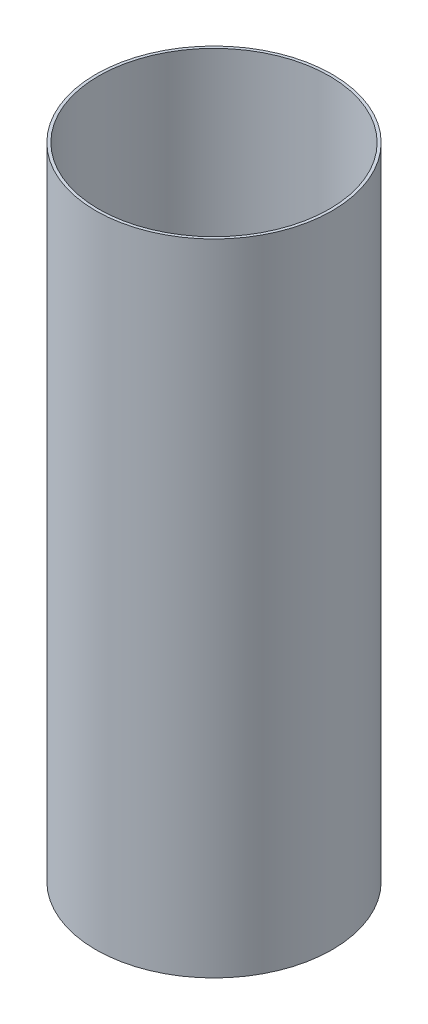
ISO-10303-21;
HEADER;
FILE_DESCRIPTION(('STEP AP214'),'2;1');
FILE_NAME('part.step','',(''),(''),'','','');
FILE_SCHEMA(('AUTOMOTIVE_DESIGN { 1 0 10303 214 1 1 1 1 }'));
ENDSEC;
DATA;
#1=APPLICATION_CONTEXT('core data for automotive mechanical design processes');
#2=APPLICATION_PROTOCOL_DEFINITION('international standard','automotive_design',2000,#1);
#3=PRODUCT_CONTEXT('',#1,'mechanical');
#4=PRODUCT('Part','Part','',(#3));
#5=PRODUCT_RELATED_PRODUCT_CATEGORY('part','',(#4));
#6=PRODUCT_DEFINITION_FORMATION('','',#4);
#7=PRODUCT_DEFINITION_CONTEXT('part definition',#1,'design');
#8=PRODUCT_DEFINITION('design','',#6,#7);
#9=PRODUCT_DEFINITION_SHAPE('','',#8);
#10=(LENGTH_UNIT() NAMED_UNIT(*) SI_UNIT(.MILLI.,.METRE.));
#11=(NAMED_UNIT(*) PLANE_ANGLE_UNIT() SI_UNIT($,.RADIAN.));
#12=(NAMED_UNIT(*) SI_UNIT($,.STERADIAN.) SOLID_ANGLE_UNIT());
#13=UNCERTAINTY_MEASURE_WITH_UNIT(LENGTH_MEASURE(1.E-05),#10,'distance_accuracy_value','');
#14=(GEOMETRIC_REPRESENTATION_CONTEXT(3) GLOBAL_UNCERTAINTY_ASSIGNED_CONTEXT((#13)) GLOBAL_UNIT_ASSIGNED_CONTEXT((#10,
#11,#12)) REPRESENTATION_CONTEXT('',''));
#15=CARTESIAN_POINT('',(0.,0.,0.));
#16=DIRECTION('',(0.,0.,1.));
#17=DIRECTION('',(1.,0.,0.));
#18=AXIS2_PLACEMENT_3D('',#15,#16,#17);
#19=CARTESIAN_POINT('',(0.,180.,0.));
#20=DIRECTION('',(0.,-1.,0.));
#21=DIRECTION('',(0.,0.,-1.));
#22=AXIS2_PLACEMENT_3D('',#19,#20,#21);
#23=CYLINDRICAL_SURFACE('',#22,32.45);
#24=CARTESIAN_POINT('',(0.,180.,0.));
#25=DIRECTION('',(0.,1.,0.));
#26=DIRECTION('',(1.,0.,0.));
#27=AXIS2_PLACEMENT_3D('',#24,#25,#26);
#28=CIRCLE('',#27,32.45);
#29=CARTESIAN_POINT('',(32.45,180.,0.));
#30=VERTEX_POINT('',#29);
#31=EDGE_CURVE('E348',#30,#30,#28,.T.);
#32=ORIENTED_EDGE('',*,*,#31,.T.);
#33=EDGE_LOOP('',(#32));
#34=FACE_BOUND('',#33,.T.);
#35=CARTESIAN_POINT('',(0.,3.,0.));
#36=DIRECTION('',(0.,-1.,0.));
#37=DIRECTION('',(0.,0.,-1.));
#38=AXIS2_PLACEMENT_3D('',#35,#36,#37);
#39=CIRCLE('',#38,32.45);
#40=CARTESIAN_POINT('',(-31.4616846497916,3.,7.94763480521534));
#41=VERTEX_POINT('',#40);
#42=CARTESIAN_POINT('',(-31.8805799123692,3.,6.05236519478465));
#43=VERTEX_POINT('',#42);
#44=EDGE_CURVE('E12',#41,#43,#39,.T.);
#45=ORIENTED_EDGE('',*,*,#44,.T.);
#46=CARTESIAN_POINT('',(0.,-343.739769784556,0.));
#47=DIRECTION('',(0.,0.0174524064372835,-0.999847695156391));
#48=DIRECTION('',(0.,-0.999847695156391,-0.0174524064372835));
#49=AXIS2_PLACEMENT_3D('',#46,#47,#48);
#50=ELLIPSE('',#49,1859.34244177795,32.45);
#51=CARTESIAN_POINT('',(-31.8865286339992,1.20000000000001,6.02094607791386));
#52=VERTEX_POINT('',#51);
#53=EDGE_CURVE('E193',#43,#52,#50,.F.);
#54=ORIENTED_EDGE('',*,*,#53,.T.);
#55=CARTESIAN_POINT('',(0.,1.20000000000001,0.));
#56=DIRECTION('',(0.,1.,0.));
#57=DIRECTION('',(0.,0.,1.));
#58=AXIS2_PLACEMENT_3D('',#55,#56,#57);
#59=CIRCLE('',#58,32.45);
#60=CARTESIAN_POINT('',(-13.5,1.20000000000001,-29.5085157200426));
#61=VERTEX_POINT('',#60);
#62=EDGE_CURVE('E362',#61,#52,#59,.T.);
#63=ORIENTED_EDGE('',*,*,#62,.F.);
#64=CARTESIAN_POINT('',(0.,-0.240000000000018,0.));
#65=DIRECTION('',(0.106064981392206,0.994359200551929,0.));
#66=DIRECTION('',(0.994359200551929,-0.106064981392206,0.));
#67=AXIS2_PLACEMENT_3D('',#64,#65,#66);
#68=ELLIPSE('',#67,32.6340823135023,32.45);
#69=CARTESIAN_POINT('',(-6.00000000000001,0.4,-31.8904766348827));
#70=VERTEX_POINT('',#69);
#71=EDGE_CURVE('E477',#61,#70,#68,.F.);
#72=ORIENTED_EDGE('',*,*,#71,.T.);
#73=DIRECTION('',(0.,-1.,0.));
#74=VECTOR('',#73,1.);
#75=CARTESIAN_POINT('',(-6.00000000000001,180.,-31.8904766348827));
#76=LINE('',#75,#74);
#77=CARTESIAN_POINT('',(-6.00000000000001,1.20000000000001,-31.8904766348827));
#78=VERTEX_POINT('',#77);
#79=EDGE_CURVE('E393',#70,#78,#76,.F.);
#80=ORIENTED_EDGE('',*,*,#79,.T.);
#81=CARTESIAN_POINT('',(31.4537310745234,1.20000000000002,-7.97905392208613));
#82=VERTEX_POINT('',#81);
#83=EDGE_CURVE('E361',#82,#78,#59,.T.);
#84=ORIENTED_EDGE('',*,*,#83,.F.);
#85=CARTESIAN_POINT('',(0.,458.319693046074,0.));
#86=DIRECTION('',(0.,0.0174524064372835,-0.999847695156391));
#87=DIRECTION('',(0.,-0.999847695156391,-0.0174524064372835));
#88=AXIS2_PLACEMENT_3D('',#85,#86,#87);
#89=ELLIPSE('',#88,1859.34244177795,32.45);
#90=CARTESIAN_POINT('',(31.4616846497916,3.,-7.94763480521534));
#91=VERTEX_POINT('',#90);
#92=EDGE_CURVE('E369',#91,#82,#89,.T.);
#93=ORIENTED_EDGE('',*,*,#92,.F.);
#94=CARTESIAN_POINT('',(0.,3.,0.));
#95=DIRECTION('',(0.,-1.,0.));
#96=DIRECTION('',(0.,0.,-1.));
#97=AXIS2_PLACEMENT_3D('',#94,#95,#96);
#98=CIRCLE('',#97,32.45);
#99=CARTESIAN_POINT('',(31.8345047565749,3.,-6.2902151714875));
#100=VERTEX_POINT('',#99);
#101=EDGE_CURVE('E366',#91,#100,#98,.T.);
#102=ORIENTED_EDGE('',*,*,#101,.T.);
#103=CARTESIAN_POINT('',(0.,-357.366185823739,0.));
#104=DIRECTION('',(0.,0.0174524064372835,0.999847695156391));
#105=DIRECTION('',(0.,-0.999847695156391,0.0174524064372835));
#106=AXIS2_PLACEMENT_3D('',#103,#104,#105);
#107=ELLIPSE('',#106,1859.34244177795,32.45);
#108=CARTESIAN_POINT('',(31.8406967880214,1.20000000000002,-6.25879605461671));
#109=VERTEX_POINT('',#108);
#110=EDGE_CURVE('E55',#100,#109,#107,.F.);
#111=ORIENTED_EDGE('',*,*,#110,.T.);
#112=CARTESIAN_POINT('',(13.5,1.20000000000001,29.5085157200426));
#113=VERTEX_POINT('',#112);
#114=EDGE_CURVE('E357',#113,#109,#59,.T.);
#115=ORIENTED_EDGE('',*,*,#114,.F.);
#116=CARTESIAN_POINT('',(0.,-0.240000000000018,0.));
#117=DIRECTION('',(-0.106064981392206,0.994359200551929,0.));
#118=DIRECTION('',(-0.994359200551929,-0.106064981392206,0.));
#119=AXIS2_PLACEMENT_3D('',#116,#117,#118);
#120=ELLIPSE('',#119,32.6340823135023,32.45);
#121=CARTESIAN_POINT('',(6.00000000000001,0.4,31.8904766348827));
#122=VERTEX_POINT('',#121);
#123=EDGE_CURVE('E398',#113,#122,#120,.F.);
#124=ORIENTED_EDGE('',*,*,#123,.T.);
#125=DIRECTION('',(0.,-1.,0.));
#126=VECTOR('',#125,1.);
#127=CARTESIAN_POINT('',(6.00000000000001,180.,31.8904766348827));
#128=LINE('',#127,#126);
#129=CARTESIAN_POINT('',(6.00000000000001,1.20000000000001,31.8904766348827));
#130=VERTEX_POINT('',#129);
#131=EDGE_CURVE('E420',#122,#130,#128,.F.);
#132=ORIENTED_EDGE('',*,*,#131,.T.);
#133=CARTESIAN_POINT('',(-31.4537310745234,1.20000000000001,7.97905392208613));
#134=VERTEX_POINT('',#133);
#135=EDGE_CURVE('E351',#134,#130,#59,.T.);
#136=ORIENTED_EDGE('',*,*,#135,.F.);
#137=CARTESIAN_POINT('',(0.,458.319693046074,0.));
#138=DIRECTION('',(0.,0.0174524064372835,0.999847695156391));
#139=DIRECTION('',(0.,-0.999847695156391,0.0174524064372835));
#140=AXIS2_PLACEMENT_3D('',#137,#138,#139);
#141=ELLIPSE('',#140,1859.34244177795,32.45);
#142=EDGE_CURVE('E65',#41,#134,#141,.T.);
#143=ORIENTED_EDGE('',*,*,#142,.F.);
#144=EDGE_LOOP('',(#45,#54,#63,#72,#80,#84,#93,#102,#111,#115,#124,#132,#136,#143));
#145=FACE_BOUND('',#144,.T.);
#146=ADVANCED_FACE('F47',(#34,#145),#23,.F.);
#147=CARTESIAN_POINT('',(0.,1.2,0.));
#148=DIRECTION('',(0.,1.,0.));
#149=DIRECTION('',(0.,0.,1.));
#150=AXIS2_PLACEMENT_3D('',#147,#148,#149);
#151=PLANE('',#150);
#152=ORIENTED_EDGE('',*,*,#62,.T.);
#153=DIRECTION('',(-1.,0.,0.));
#154=VECTOR('',#153,1.);
#155=CARTESIAN_POINT('',(0.,1.2,6.02094607791386));
#156=LINE('',#155,#154);
#157=CARTESIAN_POINT('',(-12.1063698592397,1.2,6.02094607791386));
#158=VERTEX_POINT('',#157);
#159=EDGE_CURVE('E497',#52,#158,#156,.F.);
#160=ORIENTED_EDGE('',*,*,#159,.T.);
#161=CARTESIAN_POINT('',(0.,1.2,0.));
#162=DIRECTION('',(0.,1.,0.));
#163=DIRECTION('',(0.,0.,1.));
#164=AXIS2_PLACEMENT_3D('',#161,#162,#163);
#165=CIRCLE('',#164,13.5209460779139);
#166=CARTESIAN_POINT('',(-10.9156163980921,1.2,7.97905392208613));
#167=VERTEX_POINT('',#166);
#168=EDGE_CURVE('E208',#158,#167,#165,.T.);
#169=ORIENTED_EDGE('',*,*,#168,.T.);
#170=DIRECTION('',(1.,0.,0.));
#171=VECTOR('',#170,1.);
#172=CARTESIAN_POINT('',(0.,1.2,7.97905392208613));
#173=LINE('',#172,#171);
#174=EDGE_CURVE('E209',#134,#167,#173,.T.);
#175=ORIENTED_EDGE('',*,*,#174,.F.);
#176=ORIENTED_EDGE('',*,*,#135,.T.);
#177=DIRECTION('',(0.,0.,-1.));
#178=VECTOR('',#177,1.);
#179=CARTESIAN_POINT('',(6.00000000000001,1.2,33.251));
#180=LINE('',#179,#178);
#181=CARTESIAN_POINT('',(6.00000000000001,1.2,31.5));
#182=VERTEX_POINT('',#181);
#183=EDGE_CURVE('E387',#130,#182,#180,.T.);
#184=ORIENTED_EDGE('',*,*,#183,.T.);
#185=DIRECTION('',(1.,0.,0.));
#186=VECTOR('',#185,1.);
#187=CARTESIAN_POINT('',(0.,1.2,31.5));
#188=LINE('',#187,#186);
#189=CARTESIAN_POINT('',(-6.00000000000001,1.2,31.5));
#190=VERTEX_POINT('',#189);
#191=EDGE_CURVE('E403',#190,#182,#188,.T.);
#192=ORIENTED_EDGE('',*,*,#191,.F.);
#193=DIRECTION('',(0.,0.,-1.));
#194=VECTOR('',#193,1.);
#195=CARTESIAN_POINT('',(-6.00000000000001,1.2,0.));
#196=LINE('',#195,#194);
#197=CARTESIAN_POINT('',(-6.00000000000001,1.2,12.0933866224478));
#198=VERTEX_POINT('',#197);
#199=EDGE_CURVE('E406',#190,#198,#196,.T.);
#200=ORIENTED_EDGE('',*,*,#199,.T.);
#201=CARTESIAN_POINT('',(0.,1.2,0.));
#202=DIRECTION('',(0.,-1.,0.));
#203=DIRECTION('',(0.,0.,-1.));
#204=AXIS2_PLACEMENT_3D('',#201,#202,#203);
#205=CIRCLE('',#204,13.5);
#206=CARTESIAN_POINT('',(-13.5,1.2,0.));
#207=VERTEX_POINT('',#206);
#208=EDGE_CURVE('E409',#198,#207,#205,.T.);
#209=ORIENTED_EDGE('',*,*,#208,.T.);
#210=DIRECTION('',(0.,0.,1.));
#211=VECTOR('',#210,1.);
#212=CARTESIAN_POINT('',(-13.5,1.2,-33.251));
#213=LINE('',#212,#211);
#214=EDGE_CURVE('E470',#61,#207,#213,.T.);
#215=ORIENTED_EDGE('',*,*,#214,.F.);
#216=EDGE_LOOP('',(#152,#160,#169,#175,#176,#184,#192,#200,#209,#215));
#217=FACE_BOUND('',#216,.T.);
#218=ADVANCED_FACE('F323',(#217),#151,.T.);
#219=ORIENTED_EDGE('',*,*,#114,.T.);
#220=DIRECTION('',(1.,0.,0.));
#221=VECTOR('',#220,1.);
#222=CARTESIAN_POINT('',(0.,1.2,-6.25879605461671));
#223=LINE('',#222,#221);
#224=CARTESIAN_POINT('',(11.985134742195,1.2,-6.25879605461671));
#225=VERTEX_POINT('',#224);
#226=EDGE_CURVE('E379',#109,#225,#223,.F.);
#227=ORIENTED_EDGE('',*,*,#226,.T.);
#228=CARTESIAN_POINT('',(0.,1.2,0.));
#229=DIRECTION('',(0.,1.,0.));
#230=DIRECTION('',(0.,0.,1.));
#231=AXIS2_PLACEMENT_3D('',#228,#229,#230);
#232=CIRCLE('',#231,13.5209460779139);
#233=CARTESIAN_POINT('',(10.9156163980921,1.2,-7.97905392208613));
#234=VERTEX_POINT('',#233);
#235=EDGE_CURVE('E471',#225,#234,#232,.T.);
#236=ORIENTED_EDGE('',*,*,#235,.T.);
#237=DIRECTION('',(-1.,0.,0.));
#238=VECTOR('',#237,1.);
#239=CARTESIAN_POINT('',(0.,1.2,-7.97905392208613));
#240=LINE('',#239,#238);
#241=EDGE_CURVE('E258',#82,#234,#240,.T.);
#242=ORIENTED_EDGE('',*,*,#241,.F.);
#243=ORIENTED_EDGE('',*,*,#83,.T.);
#244=DIRECTION('',(0.,0.,1.));
#245=VECTOR('',#244,1.);
#246=CARTESIAN_POINT('',(-6.00000000000001,1.2,-33.251));
#247=LINE('',#246,#245);
#248=CARTESIAN_POINT('',(-6.00000000000001,1.2,-31.5));
#249=VERTEX_POINT('',#248);
#250=EDGE_CURVE('E467',#78,#249,#247,.T.);
#251=ORIENTED_EDGE('',*,*,#250,.T.);
#252=DIRECTION('',(1.,0.,0.));
#253=VECTOR('',#252,1.);
#254=CARTESIAN_POINT('',(0.,1.2,-31.5));
#255=LINE('',#254,#253);
#256=CARTESIAN_POINT('',(6.00000000000001,1.2,-31.5));
#257=VERTEX_POINT('',#256);
#258=EDGE_CURVE('E412',#249,#257,#255,.T.);
#259=ORIENTED_EDGE('',*,*,#258,.T.);
#260=DIRECTION('',(0.,0.,-1.));
#261=VECTOR('',#260,1.);
#262=CARTESIAN_POINT('',(6.00000000000001,1.2,0.));
#263=LINE('',#262,#261);
#264=CARTESIAN_POINT('',(6.00000000000001,1.2,-12.0933866224478));
#265=VERTEX_POINT('',#264);
#266=EDGE_CURVE('E399',#265,#257,#263,.T.);
#267=ORIENTED_EDGE('',*,*,#266,.F.);
#268=CARTESIAN_POINT('',(0.,1.2,0.));
#269=DIRECTION('',(0.,-1.,0.));
#270=DIRECTION('',(0.,0.,-1.));
#271=AXIS2_PLACEMENT_3D('',#268,#269,#270);
#272=CIRCLE('',#271,13.5);
#273=CARTESIAN_POINT('',(13.5,1.2,0.));
#274=VERTEX_POINT('',#273);
#275=EDGE_CURVE('E384',#265,#274,#272,.T.);
#276=ORIENTED_EDGE('',*,*,#275,.T.);
#277=DIRECTION('',(0.,0.,-1.));
#278=VECTOR('',#277,1.);
#279=CARTESIAN_POINT('',(13.5,1.2,33.251));
#280=LINE('',#279,#278);
#281=EDGE_CURVE('E381',#113,#274,#280,.T.);
#282=ORIENTED_EDGE('',*,*,#281,.F.);
#283=EDGE_LOOP('',(#219,#227,#236,#242,#243,#251,#259,#267,#276,#282));
#284=FACE_BOUND('',#283,.T.);
#285=ADVANCED_FACE('F300',(#284),#151,.T.);
#286=CARTESIAN_POINT('',(-6.00000000000001,1.2,0.));
#287=DIRECTION('',(-1.,0.,0.));
#288=DIRECTION('',(0.,0.,1.));
#289=AXIS2_PLACEMENT_3D('',#286,#287,#288);
#290=PLANE('',#289);
#291=DIRECTION('',(0.,0.,1.));
#292=VECTOR('',#291,1.);
#293=CARTESIAN_POINT('',(-6.00000000000001,0.4,-33.251));
#294=LINE('',#293,#292);
#295=CARTESIAN_POINT('',(-6.00000000000001,0.4,-31.5));
#296=VERTEX_POINT('',#295);
#297=CARTESIAN_POINT('',(-6.00000000000001,0.4,-12.0933866224478));
#298=VERTEX_POINT('',#297);
#299=EDGE_CURVE('E473',#296,#298,#294,.T.);
#300=ORIENTED_EDGE('',*,*,#299,.T.);
#301=DIRECTION('',(0.,-1.,0.));
#302=VECTOR('',#301,1.);
#303=CARTESIAN_POINT('',(-6.00000000000001,1.2,-12.0933866224478));
#304=LINE('',#303,#302);
#305=CARTESIAN_POINT('',(-6.00000000000001,0.,-12.0933866224478));
#306=VERTEX_POINT('',#305);
#307=EDGE_CURVE('E441',#298,#306,#304,.T.);
#308=ORIENTED_EDGE('',*,*,#307,.T.);
#309=DIRECTION('',(0.,0.,-1.));
#310=VECTOR('',#309,1.);
#311=CARTESIAN_POINT('',(-6.00000000000001,0.,0.));
#312=LINE('',#311,#310);
#313=CARTESIAN_POINT('',(-6.00000000000001,0.,-31.5));
#314=VERTEX_POINT('',#313);
#315=EDGE_CURVE('E342',#306,#314,#312,.T.);
#316=ORIENTED_EDGE('',*,*,#315,.T.);
#317=DIRECTION('',(0.,-1.,0.));
#318=VECTOR('',#317,1.);
#319=CARTESIAN_POINT('',(-6.00000000000001,1.2,-31.5));
#320=LINE('',#319,#318);
#321=EDGE_CURVE('E440',#296,#314,#320,.T.);
#322=ORIENTED_EDGE('',*,*,#321,.F.);
#323=EDGE_LOOP('',(#300,#308,#316,#322));
#324=FACE_BOUND('',#323,.T.);
#325=ADVANCED_FACE('F296',(#324),#290,.F.);
#326=CARTESIAN_POINT('',(0.,1.2,0.));
#327=DIRECTION('',(0.,-1.,0.));
#328=DIRECTION('',(0.,0.,-1.));
#329=AXIS2_PLACEMENT_3D('',#326,#327,#328);
#330=CYLINDRICAL_SURFACE('',#329,13.5);
#331=CARTESIAN_POINT('',(0.,-0.240000000000001,0.));
#332=DIRECTION('',(0.106064981392206,0.994359200551929,0.));
#333=DIRECTION('',(0.994359200551929,-0.106064981392206,0.));
#334=AXIS2_PLACEMENT_3D('',#331,#332,#333);
#335=ELLIPSE('',#334,13.5765827806558,13.5);
#336=EDGE_CURVE('E364',#207,#298,#335,.F.);
#337=ORIENTED_EDGE('',*,*,#336,.F.);
#338=ORIENTED_EDGE('',*,*,#208,.F.);
#339=DIRECTION('',(0.,-1.,0.));
#340=VECTOR('',#339,1.);
#341=CARTESIAN_POINT('',(-6.00000000000001,1.2,12.0933866224478));
#342=LINE('',#341,#340);
#343=CARTESIAN_POINT('',(-6.00000000000001,0.,12.0933866224478));
#344=VERTEX_POINT('',#343);
#345=EDGE_CURVE('E444',#198,#344,#342,.T.);
#346=ORIENTED_EDGE('',*,*,#345,.T.);
#347=CARTESIAN_POINT('',(0.,0.,0.));
#348=DIRECTION('',(0.,-1.,0.));
#349=DIRECTION('',(0.,0.,-1.));
#350=AXIS2_PLACEMENT_3D('',#347,#348,#349);
#351=CIRCLE('',#350,13.5);
#352=EDGE_CURVE('E431',#344,#306,#351,.T.);
#353=ORIENTED_EDGE('',*,*,#352,.T.);
#354=ORIENTED_EDGE('',*,*,#307,.F.);
#355=EDGE_LOOP('',(#337,#338,#346,#353,#354));
#356=FACE_BOUND('',#355,.T.);
#357=ADVANCED_FACE('F299',(#356),#330,.F.);
#358=CARTESIAN_POINT('',(6.00000000000001,1.2,0.));
#359=DIRECTION('',(-1.,0.,0.));
#360=DIRECTION('',(0.,0.,1.));
#361=AXIS2_PLACEMENT_3D('',#358,#359,#360);
#362=PLANE('',#361);
#363=DIRECTION('',(0.,-1.,0.));
#364=VECTOR('',#363,1.);
#365=CARTESIAN_POINT('',(6.00000000000001,1.2,31.5));
#366=LINE('',#365,#364);
#367=CARTESIAN_POINT('',(6.00000000000001,0.4,31.5));
#368=VERTEX_POINT('',#367);
#369=CARTESIAN_POINT('',(6.00000000000001,0.,31.5));
#370=VERTEX_POINT('',#369);
#371=EDGE_CURVE('E451',#368,#370,#366,.T.);
#372=ORIENTED_EDGE('',*,*,#371,.F.);
#373=DIRECTION('',(0.,0.,-1.));
#374=VECTOR('',#373,1.);
#375=CARTESIAN_POINT('',(6.00000000000001,0.4,33.251));
#376=LINE('',#375,#374);
#377=CARTESIAN_POINT('',(6.00000000000001,0.4,12.0933866224478));
#378=VERTEX_POINT('',#377);
#379=EDGE_CURVE('E386',#368,#378,#376,.T.);
#380=ORIENTED_EDGE('',*,*,#379,.T.);
#381=DIRECTION('',(0.,-1.,0.));
#382=VECTOR('',#381,1.);
#383=CARTESIAN_POINT('',(6.00000000000001,1.2,12.0933866224478));
#384=LINE('',#383,#382);
#385=CARTESIAN_POINT('',(6.00000000000001,0.,12.0933866224478));
#386=VERTEX_POINT('',#385);
#387=EDGE_CURVE('E452',#378,#386,#384,.T.);
#388=ORIENTED_EDGE('',*,*,#387,.T.);
#389=DIRECTION('',(0.,0.,-1.));
#390=VECTOR('',#389,1.);
#391=CARTESIAN_POINT('',(6.00000000000001,0.,0.));
#392=LINE('',#391,#390);
#393=EDGE_CURVE('E422',#370,#386,#392,.T.);
#394=ORIENTED_EDGE('',*,*,#393,.F.);
#395=EDGE_LOOP('',(#372,#380,#388,#394));
#396=FACE_BOUND('',#395,.T.);
#397=ADVANCED_FACE('F304',(#396),#362,.T.);
#398=CARTESIAN_POINT('',(0.,1.2,0.));
#399=DIRECTION('',(0.,-1.,0.));
#400=DIRECTION('',(0.,0.,-1.));
#401=AXIS2_PLACEMENT_3D('',#398,#399,#400);
#402=CYLINDRICAL_SURFACE('',#401,13.5);
#403=CARTESIAN_POINT('',(0.,-0.240000000000001,0.));
#404=DIRECTION('',(-0.106064981392206,0.994359200551929,0.));
#405=DIRECTION('',(-0.994359200551929,-0.106064981392206,0.));
#406=AXIS2_PLACEMENT_3D('',#403,#404,#405);
#407=ELLIPSE('',#406,13.5765827806558,13.5);
#408=EDGE_CURVE('E360',#274,#378,#407,.F.);
#409=ORIENTED_EDGE('',*,*,#408,.F.);
#410=ORIENTED_EDGE('',*,*,#275,.F.);
#411=DIRECTION('',(0.,-1.,0.));
#412=VECTOR('',#411,1.);
#413=CARTESIAN_POINT('',(6.00000000000001,1.2,-12.0933866224478));
#414=LINE('',#413,#412);
#415=CARTESIAN_POINT('',(6.00000000000001,0.,-12.0933866224478));
#416=VERTEX_POINT('',#415);
#417=EDGE_CURVE('E415',#265,#416,#414,.T.);
#418=ORIENTED_EDGE('',*,*,#417,.T.);
#419=CARTESIAN_POINT('',(0.,0.,0.));
#420=DIRECTION('',(0.,-1.,0.));
#421=DIRECTION('',(0.,0.,-1.));
#422=AXIS2_PLACEMENT_3D('',#419,#420,#421);
#423=CIRCLE('',#422,13.5);
#424=EDGE_CURVE('E419',#416,#386,#423,.T.);
#425=ORIENTED_EDGE('',*,*,#424,.T.);
#426=ORIENTED_EDGE('',*,*,#387,.F.);
#427=EDGE_LOOP('',(#409,#410,#418,#425,#426));
#428=FACE_BOUND('',#427,.T.);
#429=ADVANCED_FACE('F314',(#428),#402,.F.);
#430=CARTESIAN_POINT('',(0.,0.,0.));
#431=DIRECTION('',(0.,1.,0.));
#432=DIRECTION('',(0.,0.,1.));
#433=AXIS2_PLACEMENT_3D('',#430,#431,#432);
#434=PLANE('',#433);
#435=ORIENTED_EDGE('',*,*,#315,.F.);
#436=ORIENTED_EDGE('',*,*,#352,.F.);
#437=DIRECTION('',(0.,0.,-1.));
#438=VECTOR('',#437,1.);
#439=CARTESIAN_POINT('',(-6.00000000000001,0.,0.));
#440=LINE('',#439,#438);
#441=CARTESIAN_POINT('',(-6.00000000000001,0.,31.5));
#442=VERTEX_POINT('',#441);
#443=EDGE_CURVE('E428',#442,#344,#440,.T.);
#444=ORIENTED_EDGE('',*,*,#443,.F.);
#445=DIRECTION('',(1.,0.,0.));
#446=VECTOR('',#445,1.);
#447=CARTESIAN_POINT('',(0.,0.,31.5));
#448=LINE('',#447,#446);
#449=EDGE_CURVE('E425',#442,#370,#448,.T.);
#450=ORIENTED_EDGE('',*,*,#449,.T.);
#451=ORIENTED_EDGE('',*,*,#393,.T.);
#452=ORIENTED_EDGE('',*,*,#424,.F.);
#453=DIRECTION('',(0.,0.,-1.));
#454=VECTOR('',#453,1.);
#455=CARTESIAN_POINT('',(6.00000000000001,0.,0.));
#456=LINE('',#455,#454);
#457=CARTESIAN_POINT('',(6.00000000000001,0.,-31.5));
#458=VERTEX_POINT('',#457);
#459=EDGE_CURVE('E416',#416,#458,#456,.T.);
#460=ORIENTED_EDGE('',*,*,#459,.T.);
#461=DIRECTION('',(1.,0.,0.));
#462=VECTOR('',#461,1.);
#463=CARTESIAN_POINT('',(0.,0.,-31.5));
#464=LINE('',#463,#462);
#465=EDGE_CURVE('E401',#314,#458,#464,.T.);
#466=ORIENTED_EDGE('',*,*,#465,.F.);
#467=EDGE_LOOP('',(#435,#436,#444,#450,#451,#452,#460,#466));
#468=FACE_BOUND('',#467,.T.);
#469=CARTESIAN_POINT('',(0.,0.,0.));
#470=DIRECTION('',(0.,1.,0.));
#471=DIRECTION('',(0.,0.,1.));
#472=AXIS2_PLACEMENT_3D('',#469,#470,#471);
#473=CIRCLE('',#472,33.25);
#474=CARTESIAN_POINT('',(0.,0.,-33.25));
#475=VERTEX_POINT('',#474);
#476=EDGE_CURVE('E345',#475,#475,#473,.T.);
#477=ORIENTED_EDGE('',*,*,#476,.F.);
#478=EDGE_LOOP('',(#477));
#479=FACE_BOUND('',#478,.T.);
#480=ADVANCED_FACE('F318',(#468,#479),#434,.F.);
#481=CARTESIAN_POINT('',(0.,180.,0.));
#482=DIRECTION('',(0.,1.,0.));
#483=DIRECTION('',(0.,0.,1.));
#484=AXIS2_PLACEMENT_3D('',#481,#482,#483);
#485=PLANE('',#484);
#486=CARTESIAN_POINT('',(0.,180.,0.));
#487=DIRECTION('',(0.,1.,0.));
#488=DIRECTION('',(0.,0.,1.));
#489=AXIS2_PLACEMENT_3D('',#486,#487,#488);
#490=CIRCLE('',#489,33.25);
#491=CARTESIAN_POINT('',(0.,180.,-33.25));
#492=VERTEX_POINT('',#491);
#493=EDGE_CURVE('E347',#492,#492,#490,.T.);
#494=ORIENTED_EDGE('',*,*,#493,.T.);
#495=EDGE_LOOP('',(#494));
#496=FACE_BOUND('',#495,.T.);
#497=ORIENTED_EDGE('',*,*,#31,.F.);
#498=EDGE_LOOP('',(#497));
#499=FACE_BOUND('',#498,.T.);
#500=ADVANCED_FACE('F330',(#496,#499),#485,.T.);
#501=CARTESIAN_POINT('',(0.,180.,0.));
#502=DIRECTION('',(0.,-1.,0.));
#503=DIRECTION('',(0.,0.,-1.));
#504=AXIS2_PLACEMENT_3D('',#501,#502,#503);
#505=CYLINDRICAL_SURFACE('',#504,33.25);
#506=CARTESIAN_POINT('',(0.,180.,-33.25));
#507=CARTESIAN_POINT('',(0.,178.125,-33.25));
#508=CARTESIAN_POINT('',(0.,176.25,-33.25));
#509=CARTESIAN_POINT('',(0.,172.5,-33.25));
#510=CARTESIAN_POINT('',(0.,170.625,-33.25));
#511=CARTESIAN_POINT('',(0.,166.875,-33.25));
#512=CARTESIAN_POINT('',(0.,165.,-33.25));
#513=CARTESIAN_POINT('',(0.,161.25,-33.25));
#514=CARTESIAN_POINT('',(0.,159.375,-33.25));
#515=CARTESIAN_POINT('',(0.,155.625,-33.25));
#516=CARTESIAN_POINT('',(0.,153.75,-33.25));
#517=CARTESIAN_POINT('',(0.,150.,-33.25));
#518=CARTESIAN_POINT('',(0.,148.125,-33.25));
#519=CARTESIAN_POINT('',(0.,144.375,-33.25));
#520=CARTESIAN_POINT('',(0.,142.5,-33.25));
#521=CARTESIAN_POINT('',(0.,138.75,-33.25));
#522=CARTESIAN_POINT('',(0.,136.875,-33.25));
#523=CARTESIAN_POINT('',(0.,133.125,-33.25));
#524=CARTESIAN_POINT('',(0.,131.25,-33.25));
#525=CARTESIAN_POINT('',(0.,127.5,-33.25));
#526=CARTESIAN_POINT('',(0.,125.625,-33.25));
#527=CARTESIAN_POINT('',(0.,121.875,-33.25));
#528=CARTESIAN_POINT('',(0.,120.,-33.25));
#529=CARTESIAN_POINT('',(0.,116.25,-33.25));
#530=CARTESIAN_POINT('',(0.,114.375,-33.25));
#531=CARTESIAN_POINT('',(0.,110.625,-33.25));
#532=CARTESIAN_POINT('',(0.,108.75,-33.25));
#533=CARTESIAN_POINT('',(0.,105.,-33.25));
#534=CARTESIAN_POINT('',(0.,103.125,-33.25));
#535=CARTESIAN_POINT('',(0.,99.375,-33.25));
#536=CARTESIAN_POINT('',(0.,97.5,-33.25));
#537=CARTESIAN_POINT('',(0.,93.75,-33.25));
#538=CARTESIAN_POINT('',(0.,91.875,-33.25));
#539=CARTESIAN_POINT('',(0.,88.125,-33.25));
#540=CARTESIAN_POINT('',(0.,86.25,-33.25));
#541=CARTESIAN_POINT('',(0.,82.5,-33.25));
#542=CARTESIAN_POINT('',(0.,80.625,-33.25));
#543=CARTESIAN_POINT('',(0.,76.875,-33.25));
#544=CARTESIAN_POINT('',(0.,75.,-33.25));
#545=CARTESIAN_POINT('',(0.,71.25,-33.25));
#546=CARTESIAN_POINT('',(0.,69.375,-33.25));
#547=CARTESIAN_POINT('',(0.,65.625,-33.25));
#548=CARTESIAN_POINT('',(0.,63.75,-33.25));
#549=CARTESIAN_POINT('',(0.,60.,-33.25));
#550=CARTESIAN_POINT('',(0.,58.125,-33.25));
#551=CARTESIAN_POINT('',(0.,54.375,-33.25));
#552=CARTESIAN_POINT('',(0.,52.5,-33.25));
#553=CARTESIAN_POINT('',(0.,48.75,-33.25));
#554=CARTESIAN_POINT('',(0.,46.875,-33.25));
#555=CARTESIAN_POINT('',(0.,43.125,-33.25));
#556=CARTESIAN_POINT('',(0.,41.25,-33.25));
#557=CARTESIAN_POINT('',(0.,37.5,-33.25));
#558=CARTESIAN_POINT('',(0.,35.625,-33.25));
#559=CARTESIAN_POINT('',(0.,31.875,-33.25));
#560=CARTESIAN_POINT('',(0.,30.,-33.25));
#561=CARTESIAN_POINT('',(0.,26.25,-33.25));
#562=CARTESIAN_POINT('',(0.,24.375,-33.25));
#563=CARTESIAN_POINT('',(0.,20.625,-33.25));
#564=CARTESIAN_POINT('',(0.,18.75,-33.25));
#565=CARTESIAN_POINT('',(0.,15.,-33.25));
#566=CARTESIAN_POINT('',(0.,13.125,-33.25));
#567=CARTESIAN_POINT('',(0.,9.37499999999998,-33.25));
#568=CARTESIAN_POINT('',(0.,7.49999999999997,-33.25));
#569=CARTESIAN_POINT('',(0.,3.74999999999997,-33.25));
#570=CARTESIAN_POINT('',(0.,1.87499999999997,-33.25));
#571=CARTESIAN_POINT('',(0.,0.,-33.25));
#572=B_SPLINE_CURVE_WITH_KNOTS('',3,(#506,#507,#508,#509,#510,#511,#512,#513,#514,#515,#516,
#517,#518,#519,#520,#521,#522,#523,#524,#525,#526,#527,#528,#529,#530,#531,#532,#533,#534,#535,
#536,#537,#538,#539,#540,#541,#542,#543,#544,#545,#546,#547,#548,#549,#550,#551,#552,#553,#554,
#555,#556,#557,#558,#559,#560,#561,#562,#563,#564,#565,#566,#567,#568,#569,#570,#571),
.UNSPECIFIED.,.F.,.F.,(4,2,2,2,2,2,2,2,2,2,2,2,2,2,2,2,2,2,2,2,2,2,2,2,2,2,2,2,2,2,2,2,4),(0.,
5.62499999999999,11.25,16.875,22.5,28.125,33.75,39.375,45.,50.625,56.25,61.875,67.5,73.125,
78.75,84.375,90.,95.625,101.25,106.875,112.5,118.125,123.75,129.375,135.,140.625,146.25,151.875,
157.5,163.125,168.75,174.375,180.),.UNSPECIFIED.);
#573=EDGE_CURVE('BSEAM49',#492,#475,#572,.T.);
#574=ORIENTED_EDGE('',*,*,#493,.F.);
#575=ORIENTED_EDGE('',*,*,#476,.T.);
#576=ORIENTED_EDGE('',*,*,#573,.T.);
#577=ORIENTED_EDGE('',*,*,#573,.F.);
#578=EDGE_LOOP('',(#574,#576,#575,#577));
#579=FACE_BOUND('',#578,.T.);
#580=ADVANCED_FACE('F49',(#579),#505,.T.);
#581=CARTESIAN_POINT('',(6.00000000000001,1.2,0.));
#582=DIRECTION('',(-1.,0.,0.));
#583=DIRECTION('',(0.,0.,1.));
#584=AXIS2_PLACEMENT_3D('',#581,#582,#583);
#585=PLANE('',#584);
#586=ORIENTED_EDGE('',*,*,#459,.F.);
#587=ORIENTED_EDGE('',*,*,#417,.F.);
#588=ORIENTED_EDGE('',*,*,#266,.T.);
#589=DIRECTION('',(0.,-1.,0.));
#590=VECTOR('',#589,1.);
#591=CARTESIAN_POINT('',(6.00000000000001,1.2,-31.5));
#592=LINE('',#591,#590);
#593=EDGE_CURVE('E354',#257,#458,#592,.T.);
#594=ORIENTED_EDGE('',*,*,#593,.T.);
#595=EDGE_LOOP('',(#586,#587,#588,#594));
#596=FACE_BOUND('',#595,.T.);
#597=ADVANCED_FACE('F294',(#596),#585,.T.);
#598=CARTESIAN_POINT('',(0.,1.2,-31.5));
#599=DIRECTION('',(0.,0.,-1.));
#600=DIRECTION('',(-1.,0.,0.));
#601=AXIS2_PLACEMENT_3D('',#598,#599,#600);
#602=PLANE('',#601);
#603=ORIENTED_EDGE('',*,*,#465,.T.);
#604=ORIENTED_EDGE('',*,*,#593,.F.);
#605=ORIENTED_EDGE('',*,*,#258,.F.);
#606=EDGE_CURVE('E437',#249,#296,#320,.T.);
#607=ORIENTED_EDGE('',*,*,#606,.T.);
#608=ORIENTED_EDGE('',*,*,#321,.T.);
#609=EDGE_LOOP('',(#603,#604,#605,#607,#608));
#610=FACE_BOUND('',#609,.T.);
#611=ADVANCED_FACE('F290',(#610),#602,.F.);
#612=CARTESIAN_POINT('',(-6.00000000000001,1.2,0.));
#613=DIRECTION('',(-1.,0.,0.));
#614=DIRECTION('',(0.,0.,1.));
#615=AXIS2_PLACEMENT_3D('',#612,#613,#614);
#616=PLANE('',#615);
#617=ORIENTED_EDGE('',*,*,#443,.T.);
#618=ORIENTED_EDGE('',*,*,#345,.F.);
#619=ORIENTED_EDGE('',*,*,#199,.F.);
#620=DIRECTION('',(0.,-1.,0.));
#621=VECTOR('',#620,1.);
#622=CARTESIAN_POINT('',(-6.00000000000001,1.2,31.5));
#623=LINE('',#622,#621);
#624=EDGE_CURVE('E446',#190,#442,#623,.T.);
#625=ORIENTED_EDGE('',*,*,#624,.T.);
#626=EDGE_LOOP('',(#617,#618,#619,#625));
#627=FACE_BOUND('',#626,.T.);
#628=ADVANCED_FACE('F293',(#627),#616,.F.);
#629=CARTESIAN_POINT('',(0.,1.2,31.5));
#630=DIRECTION('',(0.,0.,-1.));
#631=DIRECTION('',(-1.,0.,0.));
#632=AXIS2_PLACEMENT_3D('',#629,#630,#631);
#633=PLANE('',#632);
#634=ORIENTED_EDGE('',*,*,#449,.F.);
#635=ORIENTED_EDGE('',*,*,#624,.F.);
#636=ORIENTED_EDGE('',*,*,#191,.T.);
#637=EDGE_CURVE('E448',#182,#368,#366,.T.);
#638=ORIENTED_EDGE('',*,*,#637,.T.);
#639=ORIENTED_EDGE('',*,*,#371,.T.);
#640=EDGE_LOOP('',(#634,#635,#636,#638,#639));
#641=FACE_BOUND('',#640,.T.);
#642=ADVANCED_FACE('F285',(#641),#633,.T.);
#643=CARTESIAN_POINT('',(0.0253120056248903,-0.237300052733346,33.251));
#644=DIRECTION('',(-0.106064981392206,0.994359200551929,0.));
#645=DIRECTION('',(-0.994359200551929,-0.106064981392206,0.));
#646=AXIS2_PLACEMENT_3D('',#643,#644,#645);
#647=PLANE('',#646);
#648=ORIENTED_EDGE('',*,*,#408,.T.);
#649=ORIENTED_EDGE('',*,*,#379,.F.);
#650=EDGE_CURVE('E390',#122,#368,#376,.T.);
#651=ORIENTED_EDGE('',*,*,#650,.F.);
#652=ORIENTED_EDGE('',*,*,#123,.F.);
#653=ORIENTED_EDGE('',*,*,#281,.T.);
#654=EDGE_LOOP('',(#648,#649,#651,#652,#653));
#655=FACE_BOUND('',#654,.T.);
#656=ADVANCED_FACE('F282',(#655),#647,.T.);
#657=CARTESIAN_POINT('',(6.00000000000001,0.,33.251));
#658=DIRECTION('',(1.,0.,0.));
#659=DIRECTION('',(0.,0.,-1.));
#660=AXIS2_PLACEMENT_3D('',#657,#658,#659);
#661=PLANE('',#660);
#662=ORIENTED_EDGE('',*,*,#183,.F.);
#663=ORIENTED_EDGE('',*,*,#131,.F.);
#664=ORIENTED_EDGE('',*,*,#650,.T.);
#665=ORIENTED_EDGE('',*,*,#637,.F.);
#666=EDGE_LOOP('',(#662,#663,#664,#665));
#667=FACE_BOUND('',#666,.T.);
#668=ADVANCED_FACE('F277',(#667),#661,.T.);
#669=CARTESIAN_POINT('',(-0.0253120056248903,-0.237300052733346,-33.251));
#670=DIRECTION('',(0.106064981392206,0.994359200551929,0.));
#671=DIRECTION('',(-0.994359200551929,0.106064981392206,0.));
#672=AXIS2_PLACEMENT_3D('',#669,#670,#671);
#673=PLANE('',#672);
#674=ORIENTED_EDGE('',*,*,#336,.T.);
#675=ORIENTED_EDGE('',*,*,#299,.F.);
#676=EDGE_CURVE('E474',#70,#296,#294,.T.);
#677=ORIENTED_EDGE('',*,*,#676,.F.);
#678=ORIENTED_EDGE('',*,*,#71,.F.);
#679=ORIENTED_EDGE('',*,*,#214,.T.);
#680=EDGE_LOOP('',(#674,#675,#677,#678,#679));
#681=FACE_BOUND('',#680,.T.);
#682=ADVANCED_FACE('F274',(#681),#673,.T.);
#683=CARTESIAN_POINT('',(-6.00000000000001,0.,-33.251));
#684=DIRECTION('',(-1.,0.,0.));
#685=DIRECTION('',(0.,0.,1.));
#686=AXIS2_PLACEMENT_3D('',#683,#684,#685);
#687=PLANE('',#686);
#688=ORIENTED_EDGE('',*,*,#606,.F.);
#689=ORIENTED_EDGE('',*,*,#250,.F.);
#690=ORIENTED_EDGE('',*,*,#79,.F.);
#691=ORIENTED_EDGE('',*,*,#676,.T.);
#692=EDGE_LOOP('',(#688,#689,#690,#691));
#693=FACE_BOUND('',#692,.T.);
#694=ADVANCED_FACE('F245',(#693),#687,.T.);
#695=CARTESIAN_POINT('',(0.,0.,-6.23784997670285));
#696=DIRECTION('',(0.,0.0174524064372835,0.999847695156391));
#697=DIRECTION('',(0.,-0.999847695156391,0.0174524064372835));
#698=AXIS2_PLACEMENT_3D('',#695,#696,#697);
#699=PLANE('',#698);
#700=ORIENTED_EDGE('',*,*,#226,.F.);
#701=ORIENTED_EDGE('',*,*,#110,.F.);
#702=DIRECTION('',(-1.,0.,0.));
#703=VECTOR('',#702,1.);
#704=CARTESIAN_POINT('',(0.,3.,-6.2902151714875));
#705=LINE('',#704,#703);
#706=CARTESIAN_POINT('',(12.0041574243759,3.,-6.2902151714875));
#707=VERTEX_POINT('',#706);
#708=EDGE_CURVE('E267',#707,#100,#705,.F.);
#709=ORIENTED_EDGE('',*,*,#708,.F.);
#710=CARTESIAN_POINT('',(12.0041574243759,3.,-6.2902151714875));
#711=CARTESIAN_POINT('',(11.998877541222,2.4999999260718,-6.28148763773297));
#712=CARTESIAN_POINT('',(11.9935941611659,1.99999988910773,-6.27276010462365));
#713=CARTESIAN_POINT('',(11.9830204072492,0.99999988910773,-6.25530503969544));
#714=CARTESIAN_POINT('',(11.9777300333886,0.499999926071804,-6.24657750787654));
#715=CARTESIAN_POINT('',(11.9724361626257,0.,-6.23784997670285));
#716=B_SPLINE_CURVE_WITH_KNOTS('',3,(#710,#711,#712,#713,#714,#715),.UNSPECIFIED.,.F.,.F.,(4,2,
4),(0.,1.50031233019249,3.00062466038526),.UNSPECIFIED.);
#717=EDGE_CURVE('E250',#707,#225,#716,.T.);
#718=ORIENTED_EDGE('',*,*,#717,.T.);
#719=EDGE_LOOP('',(#700,#701,#709,#718));
#720=FACE_BOUND('',#719,.T.);
#721=ADVANCED_FACE('F241',(#720),#699,.T.);
#722=CARTESIAN_POINT('',(0.,0.,-7.99999999999999));
#723=DIRECTION('',(0.,0.0174524064372835,-0.999847695156391));
#724=DIRECTION('',(0.,0.999847695156391,0.0174524064372835));
#725=AXIS2_PLACEMENT_3D('',#722,#723,#724);
#726=PLANE('',#725);
#727=ORIENTED_EDGE('',*,*,#92,.T.);
#728=ORIENTED_EDGE('',*,*,#241,.T.);
#729=CARTESIAN_POINT('',(10.9773267864148,3.,-7.94763480521534));
#730=CARTESIAN_POINT('',(10.9602334785936,2.49999722233027,-7.95636238616385));
#731=CARTESIAN_POINT('',(10.943099724604,1.99999583349857,-7.96508994287011));
#732=CARTESIAN_POINT('',(10.9087513242876,0.999995833498567,-7.98254500779833));
#733=CARTESIAN_POINT('',(10.8915366779609,0.499997222330267,-7.99127251602029));
#734=CARTESIAN_POINT('',(10.8742815854658,0.,-7.99999999999999));
#735=B_SPLINE_CURVE_WITH_KNOTS('',3,(#729,#730,#731,#732,#733,#734),.UNSPECIFIED.,.F.,.F.,(4,2,
4),(0.,1.50111296092239,3.0022259218828),.UNSPECIFIED.);
#736=CARTESIAN_POINT('',(10.9773267864148,3.,-7.94763480521534));
#737=VERTEX_POINT('',#736);
#738=EDGE_CURVE('E259',#737,#234,#735,.T.);
#739=ORIENTED_EDGE('',*,*,#738,.F.);
#740=DIRECTION('',(1.,0.,0.));
#741=VECTOR('',#740,1.);
#742=CARTESIAN_POINT('',(0.,3.,-7.94763480521534));
#743=LINE('',#742,#741);
#744=EDGE_CURVE('E485',#737,#91,#743,.T.);
#745=ORIENTED_EDGE('',*,*,#744,.T.);
#746=EDGE_LOOP('',(#727,#728,#739,#745));
#747=FACE_BOUND('',#746,.T.);
#748=ADVANCED_FACE('F239',(#747),#726,.T.);
#749=CARTESIAN_POINT('',(0.,3.,0.));
#750=DIRECTION('',(0.,-1.,0.));
#751=DIRECTION('',(0.,0.,-1.));
#752=AXIS2_PLACEMENT_3D('',#749,#750,#751);
#753=PLANE('',#752);
#754=ORIENTED_EDGE('',*,*,#101,.F.);
#755=ORIENTED_EDGE('',*,*,#744,.F.);
#756=CARTESIAN_POINT('',(0.,3.,0.));
#757=DIRECTION('',(0.,-1.,0.));
#758=DIRECTION('',(0.,0.,-1.));
#759=AXIS2_PLACEMENT_3D('',#756,#757,#758);
#760=CIRCLE('',#759,13.5523651947847);
#761=EDGE_CURVE('E268',#737,#707,#760,.T.);
#762=ORIENTED_EDGE('',*,*,#761,.T.);
#763=ORIENTED_EDGE('',*,*,#708,.T.);
#764=EDGE_LOOP('',(#754,#755,#762,#763));
#765=FACE_BOUND('',#764,.T.);
#766=ADVANCED_FACE('F235',(#765),#753,.F.);
#767=CARTESIAN_POINT('',(0.,0.,0.));
#768=DIRECTION('',(0.,1.,0.));
#769=DIRECTION('',(0.,0.,-1.));
#770=AXIS2_PLACEMENT_3D('',#767,#768,#769);
#771=CONICAL_SURFACE('',#770,13.5,0.0174532925199433);
#772=ORIENTED_EDGE('',*,*,#235,.F.);
#773=ORIENTED_EDGE('',*,*,#717,.F.);
#774=ORIENTED_EDGE('',*,*,#761,.F.);
#775=ORIENTED_EDGE('',*,*,#738,.T.);
#776=EDGE_LOOP('',(#772,#773,#774,#775));
#777=FACE_BOUND('',#776,.T.);
#778=ADVANCED_FACE('F238',(#777),#771,.F.);
#779=CARTESIAN_POINT('',(0.,3.,0.));
#780=DIRECTION('',(0.,-1.,0.));
#781=DIRECTION('',(0.,0.,-1.));
#782=AXIS2_PLACEMENT_3D('',#779,#780,#781);
#783=PLANE('',#782);
#784=ORIENTED_EDGE('',*,*,#44,.F.);
#785=DIRECTION('',(-1.,0.,0.));
#786=VECTOR('',#785,1.);
#787=CARTESIAN_POINT('',(0.,3.,7.94763480521534));
#788=LINE('',#787,#786);
#789=CARTESIAN_POINT('',(-10.9773267864148,3.,7.94763480521534));
#790=VERTEX_POINT('',#789);
#791=EDGE_CURVE('E196',#790,#41,#788,.T.);
#792=ORIENTED_EDGE('',*,*,#791,.F.);
#793=CARTESIAN_POINT('',(0.,3.,0.));
#794=DIRECTION('',(0.,-1.,0.));
#795=DIRECTION('',(0.,0.,-1.));
#796=AXIS2_PLACEMENT_3D('',#793,#794,#795);
#797=CIRCLE('',#796,13.5523651947847);
#798=CARTESIAN_POINT('',(-12.1258186495498,3.,6.05236519478465));
#799=VERTEX_POINT('',#798);
#800=EDGE_CURVE('E200',#790,#799,#797,.T.);
#801=ORIENTED_EDGE('',*,*,#800,.T.);
#802=DIRECTION('',(1.,0.,0.));
#803=VECTOR('',#802,1.);
#804=CARTESIAN_POINT('',(0.,3.,6.05236519478465));
#805=LINE('',#804,#803);
#806=EDGE_CURVE('E187',#799,#43,#805,.F.);
#807=ORIENTED_EDGE('',*,*,#806,.T.);
#808=EDGE_LOOP('',(#784,#792,#801,#807));
#809=FACE_BOUND('',#808,.T.);
#810=ADVANCED_FACE('F201',(#809),#783,.F.);
#811=CARTESIAN_POINT('',(0.,0.,6.));
#812=DIRECTION('',(0.,0.0174524064372835,-0.999847695156391));
#813=DIRECTION('',(0.,0.999847695156391,0.0174524064372835));
#814=AXIS2_PLACEMENT_3D('',#811,#812,#813);
#815=PLANE('',#814);
#816=ORIENTED_EDGE('',*,*,#53,.F.);
#817=ORIENTED_EDGE('',*,*,#806,.F.);
#818=CARTESIAN_POINT('',(-12.1258186495498,3.,6.05236519478465));
#819=CARTESIAN_POINT('',(-12.1204205491591,2.49999992178205,6.04363766095524));
#820=CARTESIAN_POINT('',(-12.1150188300386,1.9999998826731,6.03491012780849));
#821=CARTESIAN_POINT('',(-12.104208154338,0.999999882673105,6.01745506288027));
#822=CARTESIAN_POINT('',(-12.0987991977578,0.499999921782053,6.00872753109881));
#823=CARTESIAN_POINT('',(-12.0933866224478,0.,6.));
#824=B_SPLINE_CURVE_WITH_KNOTS('',3,(#818,#819,#820,#821,#822,#823),.UNSPECIFIED.,.F.,.F.,(4,2,
4),(0.,1.50031612922714,3.00063225845458),.UNSPECIFIED.);
#825=EDGE_CURVE('E192',#799,#158,#824,.T.);
#826=ORIENTED_EDGE('',*,*,#825,.T.);
#827=ORIENTED_EDGE('',*,*,#159,.F.);
#828=EDGE_LOOP('',(#816,#817,#826,#827));
#829=FACE_BOUND('',#828,.T.);
#830=ADVANCED_FACE('F189',(#829),#815,.T.);
#831=CARTESIAN_POINT('',(0.,0.,7.99999999999999));
#832=DIRECTION('',(0.,0.0174524064372835,0.999847695156391));
#833=DIRECTION('',(0.,-0.999847695156391,0.0174524064372835));
#834=AXIS2_PLACEMENT_3D('',#831,#832,#833);
#835=PLANE('',#834);
#836=ORIENTED_EDGE('',*,*,#791,.T.);
#837=ORIENTED_EDGE('',*,*,#142,.T.);
#838=ORIENTED_EDGE('',*,*,#174,.T.);
#839=CARTESIAN_POINT('',(-10.9773267864148,3.,7.94763480521534));
#840=CARTESIAN_POINT('',(-10.9602334785936,2.49999722233027,7.95636238616386));
#841=CARTESIAN_POINT('',(-10.943099724604,1.99999583349857,7.96508994287011));
#842=CARTESIAN_POINT('',(-10.9087513242876,0.999995833498566,7.98254500779833));
#843=CARTESIAN_POINT('',(-10.8915366779609,0.499997222330267,7.99127251602029));
#844=CARTESIAN_POINT('',(-10.8742815854658,0.,7.99999999999999));
#845=B_SPLINE_CURVE_WITH_KNOTS('',3,(#839,#840,#841,#842,#843,#844),.UNSPECIFIED.,.F.,.F.,(4,2,
4),(0.,1.50111296092239,3.0022259218828),.UNSPECIFIED.);
#846=EDGE_CURVE('E195',#790,#167,#845,.T.);
#847=ORIENTED_EDGE('',*,*,#846,.F.);
#848=EDGE_LOOP('',(#836,#837,#838,#847));
#849=FACE_BOUND('',#848,.T.);
#850=ADVANCED_FACE('F229',(#849),#835,.T.);
#851=CARTESIAN_POINT('',(0.,0.,0.));
#852=DIRECTION('',(0.,1.,0.));
#853=DIRECTION('',(0.,0.,-1.));
#854=AXIS2_PLACEMENT_3D('',#851,#852,#853);
#855=CONICAL_SURFACE('',#854,13.5,0.0174532925199433);
#856=ORIENTED_EDGE('',*,*,#168,.F.);
#857=ORIENTED_EDGE('',*,*,#825,.F.);
#858=ORIENTED_EDGE('',*,*,#800,.F.);
#859=ORIENTED_EDGE('',*,*,#846,.T.);
#860=EDGE_LOOP('',(#856,#857,#858,#859));
#861=FACE_BOUND('',#860,.T.);
#862=ADVANCED_FACE('F207',(#861),#855,.F.);
#863=CLOSED_SHELL('',(#146,#218,#285,#325,#357,#397,#429,#480,#500,#580,#597,#611,#628,#642,
#656,#668,#682,#694,#721,#748,#766,#778,#810,#830,#850,#862));
#864=MANIFOLD_SOLID_BREP('B2',#863);
#865=ADVANCED_BREP_SHAPE_REPRESENTATION('',(#18,#864),#14);
#866=SHAPE_DEFINITION_REPRESENTATION(#9,#865);
ENDSEC;
END-ISO-10303-21;
